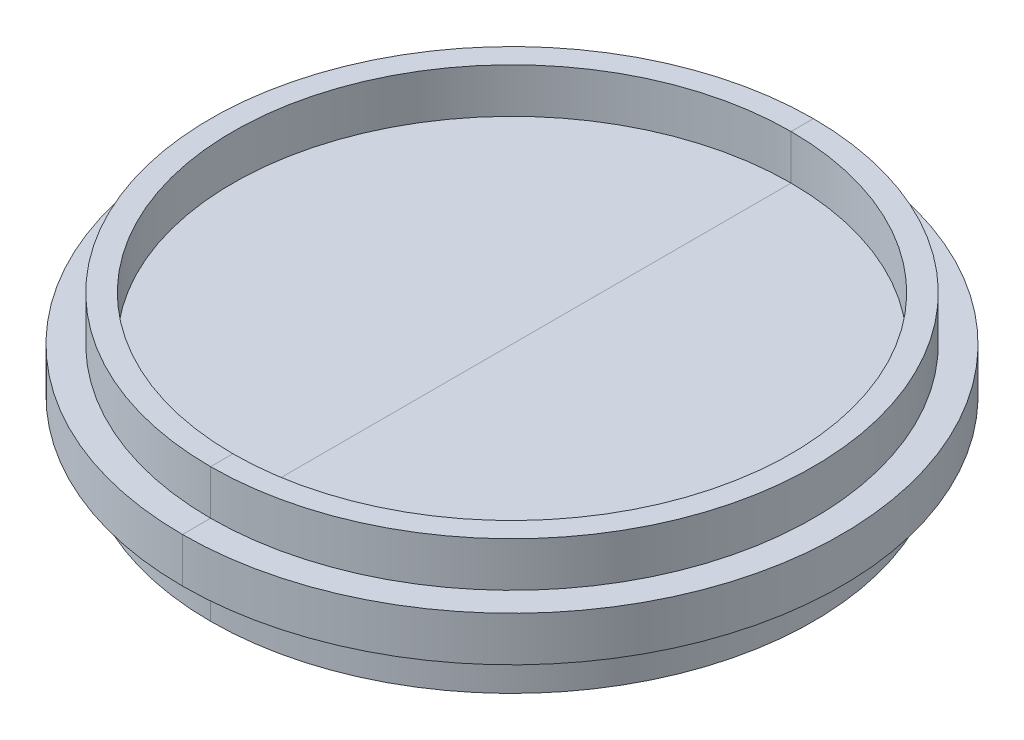
ISO-10303-21;
HEADER;
FILE_DESCRIPTION(('STEP AP214'),'2;1');
FILE_NAME('part.step','',(''),(''),'','','');
FILE_SCHEMA(('AUTOMOTIVE_DESIGN { 1 0 10303 214 1 1 1 1 }'));
ENDSEC;
DATA;
#1=APPLICATION_CONTEXT('core data for automotive mechanical design processes');
#2=APPLICATION_PROTOCOL_DEFINITION('international standard','automotive_design',2000,#1);
#3=PRODUCT_CONTEXT('',#1,'mechanical');
#4=PRODUCT('Part','Part','',(#3));
#5=PRODUCT_RELATED_PRODUCT_CATEGORY('part','',(#4));
#6=PRODUCT_DEFINITION_FORMATION('','',#4);
#7=PRODUCT_DEFINITION_CONTEXT('part definition',#1,'design');
#8=PRODUCT_DEFINITION('design','',#6,#7);
#9=PRODUCT_DEFINITION_SHAPE('','',#8);
#10=(LENGTH_UNIT() NAMED_UNIT(*) SI_UNIT(.MILLI.,.METRE.));
#11=(NAMED_UNIT(*) PLANE_ANGLE_UNIT() SI_UNIT($,.RADIAN.));
#12=(NAMED_UNIT(*) SI_UNIT($,.STERADIAN.) SOLID_ANGLE_UNIT());
#13=UNCERTAINTY_MEASURE_WITH_UNIT(LENGTH_MEASURE(1.E-05),#10,'distance_accuracy_value','');
#14=(GEOMETRIC_REPRESENTATION_CONTEXT(3) GLOBAL_UNCERTAINTY_ASSIGNED_CONTEXT((#13)) GLOBAL_UNIT_ASSIGNED_CONTEXT((#10,
#11,#12)) REPRESENTATION_CONTEXT('',''));
#15=CARTESIAN_POINT('',(0.,0.,0.));
#16=DIRECTION('',(0.,0.,1.));
#17=DIRECTION('',(1.,0.,0.));
#18=AXIS2_PLACEMENT_3D('',#15,#16,#17);
#19=CARTESIAN_POINT('',(0.,0.,0.));
#20=DIRECTION('',(1.,0.,0.));
#21=DIRECTION('',(0.,0.,-1.));
#22=AXIS2_PLACEMENT_3D('',#19,#20,#21);
#23=PLANE('',#22);
#24=DIRECTION('',(0.,0.,-1.));
#25=VECTOR('',#24,1.);
#26=CARTESIAN_POINT('',(0.,6.35,0.));
#27=LINE('',#26,#25);
#28=CARTESIAN_POINT('',(0.,6.35,79.375));
#29=VERTEX_POINT('',#28);
#30=CARTESIAN_POINT('',(0.,6.35,-79.375));
#31=VERTEX_POINT('',#30);
#32=EDGE_CURVE('E274',#29,#31,#27,.T.);
#33=ORIENTED_EDGE('',*,*,#32,.F.);
#34=DIRECTION('',(0.,-1.,0.));
#35=VECTOR('',#34,1.);
#36=CARTESIAN_POINT('',(0.,19.05,79.375));
#37=LINE('',#36,#35);
#38=CARTESIAN_POINT('',(0.,19.05,79.375));
#39=VERTEX_POINT('',#38);
#40=EDGE_CURVE('E224',#39,#29,#37,.T.);
#41=ORIENTED_EDGE('',*,*,#40,.F.);
#42=DIRECTION('',(0.,0.,-1.));
#43=VECTOR('',#42,1.);
#44=CARTESIAN_POINT('',(0.,19.05,0.));
#45=LINE('',#44,#43);
#46=CARTESIAN_POINT('',(0.,19.05,85.725));
#47=VERTEX_POINT('',#46);
#48=EDGE_CURVE('E225',#47,#39,#45,.T.);
#49=ORIENTED_EDGE('',*,*,#48,.F.);
#50=DIRECTION('',(0.,-1.,0.));
#51=VECTOR('',#50,1.);
#52=CARTESIAN_POINT('',(0.,19.05,85.725));
#53=LINE('',#52,#51);
#54=CARTESIAN_POINT('',(0.,6.35,85.725));
#55=VERTEX_POINT('',#54);
#56=EDGE_CURVE('E198',#47,#55,#53,.T.);
#57=ORIENTED_EDGE('',*,*,#56,.T.);
#58=DIRECTION('',(0.,0.,-1.));
#59=VECTOR('',#58,1.);
#60=CARTESIAN_POINT('',(0.,6.35,0.));
#61=LINE('',#60,#59);
#62=CARTESIAN_POINT('',(0.,6.35,93.726));
#63=VERTEX_POINT('',#62);
#64=EDGE_CURVE('E234',#63,#55,#61,.T.);
#65=ORIENTED_EDGE('',*,*,#64,.F.);
#66=DIRECTION('',(0.,-1.,0.));
#67=VECTOR('',#66,1.);
#68=CARTESIAN_POINT('',(0.,6.35,93.726));
#69=LINE('',#68,#67);
#70=CARTESIAN_POINT('',(0.,-6.35,93.726));
#71=VERTEX_POINT('',#70);
#72=EDGE_CURVE('E190',#63,#71,#69,.T.);
#73=ORIENTED_EDGE('',*,*,#72,.T.);
#74=DIRECTION('',(0.,0.,-1.));
#75=VECTOR('',#74,1.);
#76=CARTESIAN_POINT('',(0.,-6.35,0.));
#77=LINE('',#76,#75);
#78=CARTESIAN_POINT('',(0.,-6.35,85.725));
#79=VERTEX_POINT('',#78);
#80=EDGE_CURVE('E179',#71,#79,#77,.T.);
#81=ORIENTED_EDGE('',*,*,#80,.T.);
#82=DIRECTION('',(0.,1.,0.));
#83=VECTOR('',#82,1.);
#84=CARTESIAN_POINT('',(0.,-19.05,85.725));
#85=LINE('',#84,#83);
#86=CARTESIAN_POINT('',(0.,-19.05,85.725));
#87=VERTEX_POINT('',#86);
#88=EDGE_CURVE('E185',#87,#79,#85,.T.);
#89=ORIENTED_EDGE('',*,*,#88,.F.);
#90=DIRECTION('',(0.,0.,1.));
#91=VECTOR('',#90,1.);
#92=CARTESIAN_POINT('',(0.,-19.05,0.));
#93=LINE('',#92,#91);
#94=CARTESIAN_POINT('',(0.,-19.05,79.375));
#95=VERTEX_POINT('',#94);
#96=EDGE_CURVE('E65',#95,#87,#93,.T.);
#97=ORIENTED_EDGE('',*,*,#96,.F.);
#98=DIRECTION('',(0.,1.,0.));
#99=VECTOR('',#98,1.);
#100=CARTESIAN_POINT('',(0.,-19.05,79.375));
#101=LINE('',#100,#99);
#102=CARTESIAN_POINT('',(0.,-6.35,79.375));
#103=VERTEX_POINT('',#102);
#104=EDGE_CURVE('E132',#95,#103,#101,.T.);
#105=ORIENTED_EDGE('',*,*,#104,.T.);
#106=DIRECTION('',(0.,0.,-1.));
#107=VECTOR('',#106,1.);
#108=CARTESIAN_POINT('',(0.,-6.35,0.));
#109=LINE('',#108,#107);
#110=CARTESIAN_POINT('',(0.,-6.35,-79.375));
#111=VERTEX_POINT('',#110);
#112=EDGE_CURVE('E140',#103,#111,#109,.T.);
#113=ORIENTED_EDGE('',*,*,#112,.T.);
#114=DIRECTION('',(0.,1.,0.));
#115=VECTOR('',#114,1.);
#116=CARTESIAN_POINT('',(0.,-19.05,-79.375));
#117=LINE('',#116,#115);
#118=CARTESIAN_POINT('',(0.,-19.05,-79.375));
#119=VERTEX_POINT('',#118);
#120=EDGE_CURVE('E133',#111,#119,#117,.F.);
#121=ORIENTED_EDGE('',*,*,#120,.T.);
#122=CARTESIAN_POINT('',(0.,-19.05,-85.725));
#123=VERTEX_POINT('',#122);
#124=EDGE_CURVE('E73',#123,#119,#93,.T.);
#125=ORIENTED_EDGE('',*,*,#124,.F.);
#126=DIRECTION('',(0.,1.,0.));
#127=VECTOR('',#126,1.);
#128=CARTESIAN_POINT('',(0.,-19.05,-85.725));
#129=LINE('',#128,#127);
#130=CARTESIAN_POINT('',(0.,-6.35,-85.725));
#131=VERTEX_POINT('',#130);
#132=EDGE_CURVE('E184',#131,#123,#129,.F.);
#133=ORIENTED_EDGE('',*,*,#132,.F.);
#134=CARTESIAN_POINT('',(0.,-6.35,-93.726));
#135=VERTEX_POINT('',#134);
#136=EDGE_CURVE('E181',#131,#135,#77,.T.);
#137=ORIENTED_EDGE('',*,*,#136,.T.);
#138=DIRECTION('',(0.,-1.,0.));
#139=VECTOR('',#138,1.);
#140=CARTESIAN_POINT('',(0.,6.35,-93.726));
#141=LINE('',#140,#139);
#142=CARTESIAN_POINT('',(0.,6.35,-93.726));
#143=VERTEX_POINT('',#142);
#144=EDGE_CURVE('E192',#135,#143,#141,.F.);
#145=ORIENTED_EDGE('',*,*,#144,.T.);
#146=CARTESIAN_POINT('',(0.,6.35,-85.725));
#147=VERTEX_POINT('',#146);
#148=EDGE_CURVE('E215',#147,#143,#61,.T.);
#149=ORIENTED_EDGE('',*,*,#148,.F.);
#150=DIRECTION('',(0.,-1.,0.));
#151=VECTOR('',#150,1.);
#152=CARTESIAN_POINT('',(0.,19.05,-85.725));
#153=LINE('',#152,#151);
#154=CARTESIAN_POINT('',(0.,19.05,-85.725));
#155=VERTEX_POINT('',#154);
#156=EDGE_CURVE('E204',#147,#155,#153,.F.);
#157=ORIENTED_EDGE('',*,*,#156,.T.);
#158=CARTESIAN_POINT('',(0.,19.05,-79.375));
#159=VERTEX_POINT('',#158);
#160=EDGE_CURVE('E213',#159,#155,#45,.T.);
#161=ORIENTED_EDGE('',*,*,#160,.F.);
#162=DIRECTION('',(0.,-1.,0.));
#163=VECTOR('',#162,1.);
#164=CARTESIAN_POINT('',(0.,19.05,-79.375));
#165=LINE('',#164,#163);
#166=EDGE_CURVE('E230',#31,#159,#165,.F.);
#167=ORIENTED_EDGE('',*,*,#166,.F.);
#168=EDGE_LOOP('',(#33,#41,#49,#57,#65,#73,#81,#89,#97,#105,#113,#121,#125,#133,#137,#145,#149,
#157,#161,#167));
#169=FACE_BOUND('',#168,.T.);
#170=ADVANCED_FACE('F50',(#169),#23,.T.);
#171=CARTESIAN_POINT('',(0.,6.35,0.));
#172=DIRECTION('',(0.,-1.,0.));
#173=DIRECTION('',(0.,0.,-1.));
#174=AXIS2_PLACEMENT_3D('',#171,#172,#173);
#175=CYLINDRICAL_SURFACE('',#174,93.726);
#176=ORIENTED_EDGE('',*,*,#72,.F.);
#177=CARTESIAN_POINT('',(0.,6.35,0.));
#178=DIRECTION('',(0.,1.,0.));
#179=DIRECTION('',(0.,0.,1.));
#180=AXIS2_PLACEMENT_3D('',#177,#178,#179);
#181=CIRCLE('',#180,93.726);
#182=EDGE_CURVE('E151',#143,#63,#181,.T.);
#183=ORIENTED_EDGE('',*,*,#182,.F.);
#184=ORIENTED_EDGE('',*,*,#144,.F.);
#185=CARTESIAN_POINT('',(0.,-6.35,0.));
#186=DIRECTION('',(0.,1.,0.));
#187=DIRECTION('',(0.,0.,1.));
#188=AXIS2_PLACEMENT_3D('',#185,#186,#187);
#189=CIRCLE('',#188,93.726);
#190=EDGE_CURVE('E155',#135,#71,#189,.T.);
#191=ORIENTED_EDGE('',*,*,#190,.T.);
#192=EDGE_LOOP('',(#176,#183,#184,#191));
#193=FACE_BOUND('',#192,.T.);
#194=ADVANCED_FACE('F243',(#193),#175,.T.);
#195=CARTESIAN_POINT('',(0.,6.35,0.));
#196=DIRECTION('',(0.,1.,0.));
#197=DIRECTION('',(0.,0.,1.));
#198=AXIS2_PLACEMENT_3D('',#195,#196,#197);
#199=PLANE('',#198);
#200=ORIENTED_EDGE('',*,*,#182,.T.);
#201=ORIENTED_EDGE('',*,*,#64,.T.);
#202=CARTESIAN_POINT('',(0.,6.35,0.));
#203=DIRECTION('',(0.,1.,0.));
#204=DIRECTION('',(0.,0.,1.));
#205=AXIS2_PLACEMENT_3D('',#202,#203,#204);
#206=CIRCLE('',#205,85.725);
#207=EDGE_CURVE('E161',#147,#55,#206,.T.);
#208=ORIENTED_EDGE('',*,*,#207,.F.);
#209=ORIENTED_EDGE('',*,*,#148,.T.);
#210=EDGE_LOOP('',(#200,#201,#208,#209));
#211=FACE_BOUND('',#210,.T.);
#212=ADVANCED_FACE('F239',(#211),#199,.T.);
#213=CARTESIAN_POINT('',(0.,-6.35,0.));
#214=DIRECTION('',(0.,1.,0.));
#215=DIRECTION('',(0.,0.,1.));
#216=AXIS2_PLACEMENT_3D('',#213,#214,#215);
#217=PLANE('',#216);
#218=ORIENTED_EDGE('',*,*,#80,.F.);
#219=ORIENTED_EDGE('',*,*,#190,.F.);
#220=ORIENTED_EDGE('',*,*,#136,.F.);
#221=CARTESIAN_POINT('',(0.,-6.35,0.));
#222=DIRECTION('',(0.,1.,0.));
#223=DIRECTION('',(0.,0.,1.));
#224=AXIS2_PLACEMENT_3D('',#221,#222,#223);
#225=CIRCLE('',#224,85.725);
#226=EDGE_CURVE('E59',#131,#79,#225,.T.);
#227=ORIENTED_EDGE('',*,*,#226,.T.);
#228=EDGE_LOOP('',(#218,#219,#220,#227));
#229=FACE_BOUND('',#228,.T.);
#230=ADVANCED_FACE('F177',(#229),#217,.F.);
#231=CARTESIAN_POINT('',(0.,19.05,0.));
#232=DIRECTION('',(0.,1.,0.));
#233=DIRECTION('',(0.,0.,1.));
#234=AXIS2_PLACEMENT_3D('',#231,#232,#233);
#235=PLANE('',#234);
#236=CARTESIAN_POINT('',(0.,19.05,0.));
#237=DIRECTION('',(0.,1.,0.));
#238=DIRECTION('',(0.,0.,1.));
#239=AXIS2_PLACEMENT_3D('',#236,#237,#238);
#240=CIRCLE('',#239,85.725);
#241=EDGE_CURVE('E158',#155,#47,#240,.T.);
#242=ORIENTED_EDGE('',*,*,#241,.T.);
#243=ORIENTED_EDGE('',*,*,#48,.T.);
#244=CARTESIAN_POINT('',(0.,19.05,0.));
#245=DIRECTION('',(0.,1.,0.));
#246=DIRECTION('',(0.,0.,1.));
#247=AXIS2_PLACEMENT_3D('',#244,#245,#246);
#248=CIRCLE('',#247,79.375);
#249=EDGE_CURVE('E164',#159,#39,#248,.T.);
#250=ORIENTED_EDGE('',*,*,#249,.F.);
#251=ORIENTED_EDGE('',*,*,#160,.T.);
#252=EDGE_LOOP('',(#242,#243,#250,#251));
#253=FACE_BOUND('',#252,.T.);
#254=ADVANCED_FACE('F222',(#253),#235,.T.);
#255=CARTESIAN_POINT('',(0.,19.05,0.));
#256=DIRECTION('',(0.,-1.,0.));
#257=DIRECTION('',(0.,0.,-1.));
#258=AXIS2_PLACEMENT_3D('',#255,#256,#257);
#259=CYLINDRICAL_SURFACE('',#258,85.725);
#260=ORIENTED_EDGE('',*,*,#56,.F.);
#261=ORIENTED_EDGE('',*,*,#241,.F.);
#262=ORIENTED_EDGE('',*,*,#156,.F.);
#263=ORIENTED_EDGE('',*,*,#207,.T.);
#264=EDGE_LOOP('',(#260,#261,#262,#263));
#265=FACE_BOUND('',#264,.T.);
#266=ADVANCED_FACE('F52',(#265),#259,.T.);
#267=CARTESIAN_POINT('',(0.,19.05,0.));
#268=DIRECTION('',(0.,-1.,0.));
#269=DIRECTION('',(0.,0.,-1.));
#270=AXIS2_PLACEMENT_3D('',#267,#268,#269);
#271=CYLINDRICAL_SURFACE('',#270,79.375);
#272=ORIENTED_EDGE('',*,*,#249,.T.);
#273=ORIENTED_EDGE('',*,*,#40,.T.);
#274=CARTESIAN_POINT('',(0.,6.35,0.));
#275=DIRECTION('',(0.,1.,0.));
#276=DIRECTION('',(0.,0.,1.));
#277=AXIS2_PLACEMENT_3D('',#274,#275,#276);
#278=CIRCLE('',#277,79.375);
#279=EDGE_CURVE('E138',#29,#31,#278,.F.);
#280=ORIENTED_EDGE('',*,*,#279,.T.);
#281=ORIENTED_EDGE('',*,*,#166,.T.);
#282=EDGE_LOOP('',(#272,#273,#280,#281));
#283=FACE_BOUND('',#282,.T.);
#284=ADVANCED_FACE('F264',(#283),#271,.F.);
#285=ORIENTED_EDGE('',*,*,#279,.F.);
#286=ORIENTED_EDGE('',*,*,#32,.T.);
#287=EDGE_LOOP('',(#285,#286));
#288=FACE_BOUND('',#287,.T.);
#289=ADVANCED_FACE('F251',(#288),#199,.T.);
#290=CARTESIAN_POINT('',(0.,-19.05,0.));
#291=DIRECTION('',(0.,1.,0.));
#292=DIRECTION('',(0.,0.,1.));
#293=AXIS2_PLACEMENT_3D('',#290,#291,#292);
#294=CYLINDRICAL_SURFACE('',#293,85.725);
#295=ORIENTED_EDGE('',*,*,#226,.F.);
#296=ORIENTED_EDGE('',*,*,#132,.T.);
#297=CARTESIAN_POINT('',(0.,-19.05,0.));
#298=DIRECTION('',(0.,1.,0.));
#299=DIRECTION('',(0.,0.,1.));
#300=AXIS2_PLACEMENT_3D('',#297,#298,#299);
#301=CIRCLE('',#300,85.725);
#302=EDGE_CURVE('E168',#123,#87,#301,.T.);
#303=ORIENTED_EDGE('',*,*,#302,.T.);
#304=ORIENTED_EDGE('',*,*,#88,.T.);
#305=EDGE_LOOP('',(#295,#296,#303,#304));
#306=FACE_BOUND('',#305,.T.);
#307=ADVANCED_FACE('F183',(#306),#294,.T.);
#308=CARTESIAN_POINT('',(0.,-19.05,0.));
#309=DIRECTION('',(0.,-1.,0.));
#310=DIRECTION('',(0.,0.,1.));
#311=AXIS2_PLACEMENT_3D('',#308,#309,#310);
#312=PLANE('',#311);
#313=ORIENTED_EDGE('',*,*,#302,.F.);
#314=ORIENTED_EDGE('',*,*,#124,.T.);
#315=CARTESIAN_POINT('',(0.,-19.05,0.));
#316=DIRECTION('',(0.,1.,0.));
#317=DIRECTION('',(0.,0.,1.));
#318=AXIS2_PLACEMENT_3D('',#315,#316,#317);
#319=CIRCLE('',#318,79.375);
#320=EDGE_CURVE('E13',#119,#95,#319,.T.);
#321=ORIENTED_EDGE('',*,*,#320,.T.);
#322=ORIENTED_EDGE('',*,*,#96,.T.);
#323=EDGE_LOOP('',(#313,#314,#321,#322));
#324=FACE_BOUND('',#323,.T.);
#325=ADVANCED_FACE('F258',(#324),#312,.T.);
#326=CARTESIAN_POINT('',(0.,-19.05,0.));
#327=DIRECTION('',(0.,1.,0.));
#328=DIRECTION('',(0.,0.,1.));
#329=AXIS2_PLACEMENT_3D('',#326,#327,#328);
#330=CYLINDRICAL_SURFACE('',#329,79.375);
#331=ORIENTED_EDGE('',*,*,#120,.F.);
#332=CARTESIAN_POINT('',(0.,-6.35,0.));
#333=DIRECTION('',(0.,1.,0.));
#334=DIRECTION('',(0.,0.,1.));
#335=AXIS2_PLACEMENT_3D('',#332,#333,#334);
#336=CIRCLE('',#335,79.375);
#337=EDGE_CURVE('E129',#111,#103,#336,.T.);
#338=ORIENTED_EDGE('',*,*,#337,.T.);
#339=ORIENTED_EDGE('',*,*,#104,.F.);
#340=ORIENTED_EDGE('',*,*,#320,.F.);
#341=EDGE_LOOP('',(#331,#338,#339,#340));
#342=FACE_BOUND('',#341,.T.);
#343=ADVANCED_FACE('F131',(#342),#330,.F.);
#344=ORIENTED_EDGE('',*,*,#112,.F.);
#345=ORIENTED_EDGE('',*,*,#337,.F.);
#346=EDGE_LOOP('',(#344,#345));
#347=FACE_BOUND('',#346,.T.);
#348=ADVANCED_FACE('F143',(#347),#217,.F.);
#349=CLOSED_SHELL('',(#170,#194,#212,#230,#254,#266,#284,#289,#307,#325,#343,#348));
#350=MANIFOLD_SOLID_BREP('B2',#349);
#351=CARTESIAN_POINT('',(0.,0.,0.));
#352=DIRECTION('',(1.,0.,0.));
#353=DIRECTION('',(0.,0.,-1.));
#354=AXIS2_PLACEMENT_3D('',#351,#352,#353);
#355=PLANE('',#354);
#356=DIRECTION('',(0.,0.,-1.));
#357=VECTOR('',#356,1.);
#358=CARTESIAN_POINT('',(0.,6.35,0.));
#359=LINE('',#358,#357);
#360=CARTESIAN_POINT('',(0.,6.35,79.375));
#361=VERTEX_POINT('',#360);
#362=CARTESIAN_POINT('',(0.,6.35,-79.375));
#363=VERTEX_POINT('',#362);
#364=EDGE_CURVE('E357',#361,#363,#359,.T.);
#365=ORIENTED_EDGE('',*,*,#364,.T.);
#366=DIRECTION('',(0.,-1.,0.));
#367=VECTOR('',#366,1.);
#368=CARTESIAN_POINT('',(0.,19.05,-79.375));
#369=LINE('',#368,#367);
#370=CARTESIAN_POINT('',(0.,19.05,-79.375));
#371=VERTEX_POINT('',#370);
#372=EDGE_CURVE('E481',#363,#371,#369,.F.);
#373=ORIENTED_EDGE('',*,*,#372,.T.);
#374=DIRECTION('',(0.,0.,-1.));
#375=VECTOR('',#374,1.);
#376=CARTESIAN_POINT('',(0.,19.05,0.));
#377=LINE('',#376,#375);
#378=CARTESIAN_POINT('',(0.,19.05,-85.725));
#379=VERTEX_POINT('',#378);
#380=EDGE_CURVE('E477',#371,#379,#377,.T.);
#381=ORIENTED_EDGE('',*,*,#380,.T.);
#382=DIRECTION('',(0.,-1.,0.));
#383=VECTOR('',#382,1.);
#384=CARTESIAN_POINT('',(0.,19.05,-85.725));
#385=LINE('',#384,#383);
#386=CARTESIAN_POINT('',(0.,6.35,-85.725));
#387=VERTEX_POINT('',#386);
#388=EDGE_CURVE('E457',#387,#379,#385,.F.);
#389=ORIENTED_EDGE('',*,*,#388,.F.);
#390=DIRECTION('',(0.,0.,-1.));
#391=VECTOR('',#390,1.);
#392=CARTESIAN_POINT('',(0.,6.35,0.));
#393=LINE('',#392,#391);
#394=CARTESIAN_POINT('',(0.,6.35,-93.726));
#395=VERTEX_POINT('',#394);
#396=EDGE_CURVE('E470',#387,#395,#393,.T.);
#397=ORIENTED_EDGE('',*,*,#396,.T.);
#398=DIRECTION('',(0.,-1.,0.));
#399=VECTOR('',#398,1.);
#400=CARTESIAN_POINT('',(0.,6.35,-93.726));
#401=LINE('',#400,#399);
#402=CARTESIAN_POINT('',(0.,-6.35,-93.726));
#403=VERTEX_POINT('',#402);
#404=EDGE_CURVE('E464',#403,#395,#401,.F.);
#405=ORIENTED_EDGE('',*,*,#404,.F.);
#406=DIRECTION('',(0.,0.,-1.));
#407=VECTOR('',#406,1.);
#408=CARTESIAN_POINT('',(0.,-6.35,0.));
#409=LINE('',#408,#407);
#410=CARTESIAN_POINT('',(0.,-6.35,-85.725));
#411=VERTEX_POINT('',#410);
#412=EDGE_CURVE('E465',#411,#403,#409,.T.);
#413=ORIENTED_EDGE('',*,*,#412,.F.);
#414=DIRECTION('',(0.,1.,0.));
#415=VECTOR('',#414,1.);
#416=CARTESIAN_POINT('',(0.,-19.05,-85.725));
#417=LINE('',#416,#415);
#418=CARTESIAN_POINT('',(0.,-19.05,-85.725));
#419=VERTEX_POINT('',#418);
#420=EDGE_CURVE('E460',#411,#419,#417,.F.);
#421=ORIENTED_EDGE('',*,*,#420,.T.);
#422=DIRECTION('',(0.,0.,1.));
#423=VECTOR('',#422,1.);
#424=CARTESIAN_POINT('',(0.,-19.05,0.));
#425=LINE('',#424,#423);
#426=CARTESIAN_POINT('',(0.,-19.05,-79.375));
#427=VERTEX_POINT('',#426);
#428=EDGE_CURVE('E362',#419,#427,#425,.T.);
#429=ORIENTED_EDGE('',*,*,#428,.T.);
#430=DIRECTION('',(0.,1.,0.));
#431=VECTOR('',#430,1.);
#432=CARTESIAN_POINT('',(0.,-19.05,-79.375));
#433=LINE('',#432,#431);
#434=CARTESIAN_POINT('',(0.,-6.35,-79.375));
#435=VERTEX_POINT('',#434);
#436=EDGE_CURVE('E442',#435,#427,#433,.F.);
#437=ORIENTED_EDGE('',*,*,#436,.F.);
#438=DIRECTION('',(0.,0.,-1.));
#439=VECTOR('',#438,1.);
#440=CARTESIAN_POINT('',(0.,-6.35,0.));
#441=LINE('',#440,#439);
#442=CARTESIAN_POINT('',(0.,-6.35,79.375));
#443=VERTEX_POINT('',#442);
#444=EDGE_CURVE('E443',#443,#435,#441,.T.);
#445=ORIENTED_EDGE('',*,*,#444,.F.);
#446=DIRECTION('',(0.,1.,0.));
#447=VECTOR('',#446,1.);
#448=CARTESIAN_POINT('',(0.,-19.05,79.375));
#449=LINE('',#448,#447);
#450=CARTESIAN_POINT('',(0.,-19.05,79.375));
#451=VERTEX_POINT('',#450);
#452=EDGE_CURVE('E435',#451,#443,#449,.T.);
#453=ORIENTED_EDGE('',*,*,#452,.F.);
#454=CARTESIAN_POINT('',(0.,-19.05,85.725));
#455=VERTEX_POINT('',#454);
#456=EDGE_CURVE('E48',#451,#455,#425,.T.);
#457=ORIENTED_EDGE('',*,*,#456,.T.);
#458=DIRECTION('',(0.,1.,0.));
#459=VECTOR('',#458,1.);
#460=CARTESIAN_POINT('',(0.,-19.05,85.725));
#461=LINE('',#460,#459);
#462=CARTESIAN_POINT('',(0.,-6.35,85.725));
#463=VERTEX_POINT('',#462);
#464=EDGE_CURVE('E370',#455,#463,#461,.T.);
#465=ORIENTED_EDGE('',*,*,#464,.T.);
#466=CARTESIAN_POINT('',(0.,-6.35,93.726));
#467=VERTEX_POINT('',#466);
#468=EDGE_CURVE('E462',#467,#463,#409,.T.);
#469=ORIENTED_EDGE('',*,*,#468,.F.);
#470=DIRECTION('',(0.,-1.,0.));
#471=VECTOR('',#470,1.);
#472=CARTESIAN_POINT('',(0.,6.35,93.726));
#473=LINE('',#472,#471);
#474=CARTESIAN_POINT('',(0.,6.35,93.726));
#475=VERTEX_POINT('',#474);
#476=EDGE_CURVE('E467',#475,#467,#473,.T.);
#477=ORIENTED_EDGE('',*,*,#476,.F.);
#478=CARTESIAN_POINT('',(0.,6.35,85.725));
#479=VERTEX_POINT('',#478);
#480=EDGE_CURVE('E469',#475,#479,#393,.T.);
#481=ORIENTED_EDGE('',*,*,#480,.T.);
#482=DIRECTION('',(0.,-1.,0.));
#483=VECTOR('',#482,1.);
#484=CARTESIAN_POINT('',(0.,19.05,85.725));
#485=LINE('',#484,#483);
#486=CARTESIAN_POINT('',(0.,19.05,85.725));
#487=VERTEX_POINT('',#486);
#488=EDGE_CURVE('E475',#487,#479,#485,.T.);
#489=ORIENTED_EDGE('',*,*,#488,.F.);
#490=CARTESIAN_POINT('',(0.,19.05,79.375));
#491=VERTEX_POINT('',#490);
#492=EDGE_CURVE('E473',#487,#491,#377,.T.);
#493=ORIENTED_EDGE('',*,*,#492,.T.);
#494=DIRECTION('',(0.,-1.,0.));
#495=VECTOR('',#494,1.);
#496=CARTESIAN_POINT('',(0.,19.05,79.375));
#497=LINE('',#496,#495);
#498=EDGE_CURVE('E480',#491,#361,#497,.T.);
#499=ORIENTED_EDGE('',*,*,#498,.T.);
#500=EDGE_LOOP('',(#365,#373,#381,#389,#397,#405,#413,#421,#429,#437,#445,#453,#457,#465,#469,
#477,#481,#489,#493,#499));
#501=FACE_BOUND('',#500,.T.);
#502=ADVANCED_FACE('F354',(#501),#355,.F.);
#503=CARTESIAN_POINT('',(0.,6.35,0.));
#504=DIRECTION('',(0.,-1.,0.));
#505=DIRECTION('',(0.,0.,-1.));
#506=AXIS2_PLACEMENT_3D('',#503,#504,#505);
#507=CYLINDRICAL_SURFACE('',#506,93.726);
#508=CARTESIAN_POINT('',(0.,6.35,0.));
#509=DIRECTION('',(0.,1.,0.));
#510=DIRECTION('',(0.,0.,1.));
#511=AXIS2_PLACEMENT_3D('',#508,#509,#510);
#512=CIRCLE('',#511,93.726);
#513=EDGE_CURVE('E453',#475,#395,#512,.T.);
#514=ORIENTED_EDGE('',*,*,#513,.F.);
#515=ORIENTED_EDGE('',*,*,#476,.T.);
#516=CARTESIAN_POINT('',(0.,-6.35,0.));
#517=DIRECTION('',(0.,1.,0.));
#518=DIRECTION('',(0.,0.,1.));
#519=AXIS2_PLACEMENT_3D('',#516,#517,#518);
#520=CIRCLE('',#519,93.726);
#521=EDGE_CURVE('E502',#467,#403,#520,.T.);
#522=ORIENTED_EDGE('',*,*,#521,.T.);
#523=ORIENTED_EDGE('',*,*,#404,.T.);
#524=EDGE_LOOP('',(#514,#515,#522,#523));
#525=FACE_BOUND('',#524,.T.);
#526=ADVANCED_FACE('F518',(#525),#507,.T.);
#527=CARTESIAN_POINT('',(0.,-6.35,0.));
#528=DIRECTION('',(0.,1.,0.));
#529=DIRECTION('',(0.,0.,1.));
#530=AXIS2_PLACEMENT_3D('',#527,#528,#529);
#531=PLANE('',#530);
#532=ORIENTED_EDGE('',*,*,#521,.F.);
#533=ORIENTED_EDGE('',*,*,#468,.T.);
#534=CARTESIAN_POINT('',(0.,-6.35,0.));
#535=DIRECTION('',(0.,1.,0.));
#536=DIRECTION('',(0.,0.,1.));
#537=AXIS2_PLACEMENT_3D('',#534,#535,#536);
#538=CIRCLE('',#537,85.725);
#539=EDGE_CURVE('E525',#463,#411,#538,.T.);
#540=ORIENTED_EDGE('',*,*,#539,.T.);
#541=ORIENTED_EDGE('',*,*,#412,.T.);
#542=EDGE_LOOP('',(#532,#533,#540,#541));
#543=FACE_BOUND('',#542,.T.);
#544=ADVANCED_FACE('F526',(#543),#531,.F.);
#545=CARTESIAN_POINT('',(0.,-19.05,0.));
#546=DIRECTION('',(0.,1.,0.));
#547=DIRECTION('',(0.,0.,1.));
#548=AXIS2_PLACEMENT_3D('',#545,#546,#547);
#549=CYLINDRICAL_SURFACE('',#548,85.725);
#550=ORIENTED_EDGE('',*,*,#420,.F.);
#551=ORIENTED_EDGE('',*,*,#539,.F.);
#552=ORIENTED_EDGE('',*,*,#464,.F.);
#553=CARTESIAN_POINT('',(0.,-19.05,0.));
#554=DIRECTION('',(0.,1.,0.));
#555=DIRECTION('',(0.,0.,1.));
#556=AXIS2_PLACEMENT_3D('',#553,#554,#555);
#557=CIRCLE('',#556,85.725);
#558=EDGE_CURVE('E527',#455,#419,#557,.T.);
#559=ORIENTED_EDGE('',*,*,#558,.T.);
#560=EDGE_LOOP('',(#550,#551,#552,#559));
#561=FACE_BOUND('',#560,.T.);
#562=ADVANCED_FACE('F546',(#561),#549,.T.);
#563=CARTESIAN_POINT('',(0.,-19.05,0.));
#564=DIRECTION('',(0.,-1.,0.));
#565=DIRECTION('',(0.,0.,1.));
#566=AXIS2_PLACEMENT_3D('',#563,#564,#565);
#567=PLANE('',#566);
#568=ORIENTED_EDGE('',*,*,#428,.F.);
#569=ORIENTED_EDGE('',*,*,#558,.F.);
#570=ORIENTED_EDGE('',*,*,#456,.F.);
#571=CARTESIAN_POINT('',(0.,-19.05,0.));
#572=DIRECTION('',(0.,1.,0.));
#573=DIRECTION('',(0.,0.,1.));
#574=AXIS2_PLACEMENT_3D('',#571,#572,#573);
#575=CIRCLE('',#574,79.375);
#576=EDGE_CURVE('E440',#451,#427,#575,.T.);
#577=ORIENTED_EDGE('',*,*,#576,.T.);
#578=EDGE_LOOP('',(#568,#569,#570,#577));
#579=FACE_BOUND('',#578,.T.);
#580=ADVANCED_FACE('F530',(#579),#567,.T.);
#581=CARTESIAN_POINT('',(0.,-19.05,0.));
#582=DIRECTION('',(0.,1.,0.));
#583=DIRECTION('',(0.,0.,1.));
#584=AXIS2_PLACEMENT_3D('',#581,#582,#583);
#585=CYLINDRICAL_SURFACE('',#584,79.375);
#586=CARTESIAN_POINT('',(0.,-6.35,0.));
#587=DIRECTION('',(0.,1.,0.));
#588=DIRECTION('',(0.,0.,1.));
#589=AXIS2_PLACEMENT_3D('',#586,#587,#588);
#590=CIRCLE('',#589,79.375);
#591=EDGE_CURVE('E439',#443,#435,#590,.T.);
#592=ORIENTED_EDGE('',*,*,#591,.T.);
#593=ORIENTED_EDGE('',*,*,#436,.T.);
#594=ORIENTED_EDGE('',*,*,#576,.F.);
#595=ORIENTED_EDGE('',*,*,#452,.T.);
#596=EDGE_LOOP('',(#592,#593,#594,#595));
#597=FACE_BOUND('',#596,.T.);
#598=ADVANCED_FACE('F437',(#597),#585,.F.);
#599=ORIENTED_EDGE('',*,*,#591,.F.);
#600=ORIENTED_EDGE('',*,*,#444,.T.);
#601=EDGE_LOOP('',(#599,#600));
#602=FACE_BOUND('',#601,.T.);
#603=ADVANCED_FACE('F449',(#602),#531,.F.);
#604=CARTESIAN_POINT('',(0.,6.35,0.));
#605=DIRECTION('',(0.,1.,0.));
#606=DIRECTION('',(0.,0.,1.));
#607=AXIS2_PLACEMENT_3D('',#604,#605,#606);
#608=PLANE('',#607);
#609=ORIENTED_EDGE('',*,*,#480,.F.);
#610=ORIENTED_EDGE('',*,*,#513,.T.);
#611=ORIENTED_EDGE('',*,*,#396,.F.);
#612=CARTESIAN_POINT('',(0.,6.35,0.));
#613=DIRECTION('',(0.,1.,0.));
#614=DIRECTION('',(0.,0.,1.));
#615=AXIS2_PLACEMENT_3D('',#612,#613,#614);
#616=CIRCLE('',#615,85.725);
#617=EDGE_CURVE('E503',#479,#387,#616,.T.);
#618=ORIENTED_EDGE('',*,*,#617,.F.);
#619=EDGE_LOOP('',(#609,#610,#611,#618));
#620=FACE_BOUND('',#619,.T.);
#621=ADVANCED_FACE('F513',(#620),#608,.T.);
#622=CARTESIAN_POINT('',(0.,19.05,0.));
#623=DIRECTION('',(0.,1.,0.));
#624=DIRECTION('',(0.,0.,1.));
#625=AXIS2_PLACEMENT_3D('',#622,#623,#624);
#626=PLANE('',#625);
#627=ORIENTED_EDGE('',*,*,#492,.F.);
#628=CARTESIAN_POINT('',(0.,19.05,0.));
#629=DIRECTION('',(0.,1.,0.));
#630=DIRECTION('',(0.,0.,1.));
#631=AXIS2_PLACEMENT_3D('',#628,#629,#630);
#632=CIRCLE('',#631,85.725);
#633=EDGE_CURVE('E499',#487,#379,#632,.T.);
#634=ORIENTED_EDGE('',*,*,#633,.T.);
#635=ORIENTED_EDGE('',*,*,#380,.F.);
#636=CARTESIAN_POINT('',(0.,19.05,0.));
#637=DIRECTION('',(0.,1.,0.));
#638=DIRECTION('',(0.,0.,1.));
#639=AXIS2_PLACEMENT_3D('',#636,#637,#638);
#640=CIRCLE('',#639,79.375);
#641=EDGE_CURVE('E493',#491,#371,#640,.T.);
#642=ORIENTED_EDGE('',*,*,#641,.F.);
#643=EDGE_LOOP('',(#627,#634,#635,#642));
#644=FACE_BOUND('',#643,.T.);
#645=ADVANCED_FACE('F500',(#644),#626,.T.);
#646=CARTESIAN_POINT('',(0.,19.05,0.));
#647=DIRECTION('',(0.,-1.,0.));
#648=DIRECTION('',(0.,0.,-1.));
#649=AXIS2_PLACEMENT_3D('',#646,#647,#648);
#650=CYLINDRICAL_SURFACE('',#649,79.375);
#651=ORIENTED_EDGE('',*,*,#498,.F.);
#652=ORIENTED_EDGE('',*,*,#641,.T.);
#653=ORIENTED_EDGE('',*,*,#372,.F.);
#654=CARTESIAN_POINT('',(0.,6.35,0.));
#655=DIRECTION('',(0.,1.,0.));
#656=DIRECTION('',(0.,0.,1.));
#657=AXIS2_PLACEMENT_3D('',#654,#655,#656);
#658=CIRCLE('',#657,79.375);
#659=EDGE_CURVE('E450',#363,#361,#658,.F.);
#660=ORIENTED_EDGE('',*,*,#659,.T.);
#661=EDGE_LOOP('',(#651,#652,#653,#660));
#662=FACE_BOUND('',#661,.T.);
#663=ADVANCED_FACE('F492',(#662),#650,.F.);
#664=ORIENTED_EDGE('',*,*,#364,.F.);
#665=ORIENTED_EDGE('',*,*,#659,.F.);
#666=EDGE_LOOP('',(#664,#665));
#667=FACE_BOUND('',#666,.T.);
#668=ADVANCED_FACE('F491',(#667),#608,.T.);
#669=CARTESIAN_POINT('',(0.,19.05,0.));
#670=DIRECTION('',(0.,-1.,0.));
#671=DIRECTION('',(0.,0.,-1.));
#672=AXIS2_PLACEMENT_3D('',#669,#670,#671);
#673=CYLINDRICAL_SURFACE('',#672,85.725);
#674=ORIENTED_EDGE('',*,*,#633,.F.);
#675=ORIENTED_EDGE('',*,*,#488,.T.);
#676=ORIENTED_EDGE('',*,*,#617,.T.);
#677=ORIENTED_EDGE('',*,*,#388,.T.);
#678=EDGE_LOOP('',(#674,#675,#676,#677));
#679=FACE_BOUND('',#678,.T.);
#680=ADVANCED_FACE('F531',(#679),#673,.T.);
#681=CLOSED_SHELL('',(#502,#526,#544,#562,#580,#598,#603,#621,#645,#663,#668,#680));
#682=MANIFOLD_SOLID_BREP('B7',#681);
#683=ADVANCED_BREP_SHAPE_REPRESENTATION('',(#18,#350,#682),#14);
#684=SHAPE_DEFINITION_REPRESENTATION(#9,#683);
ENDSEC;
END-ISO-10303-21;
